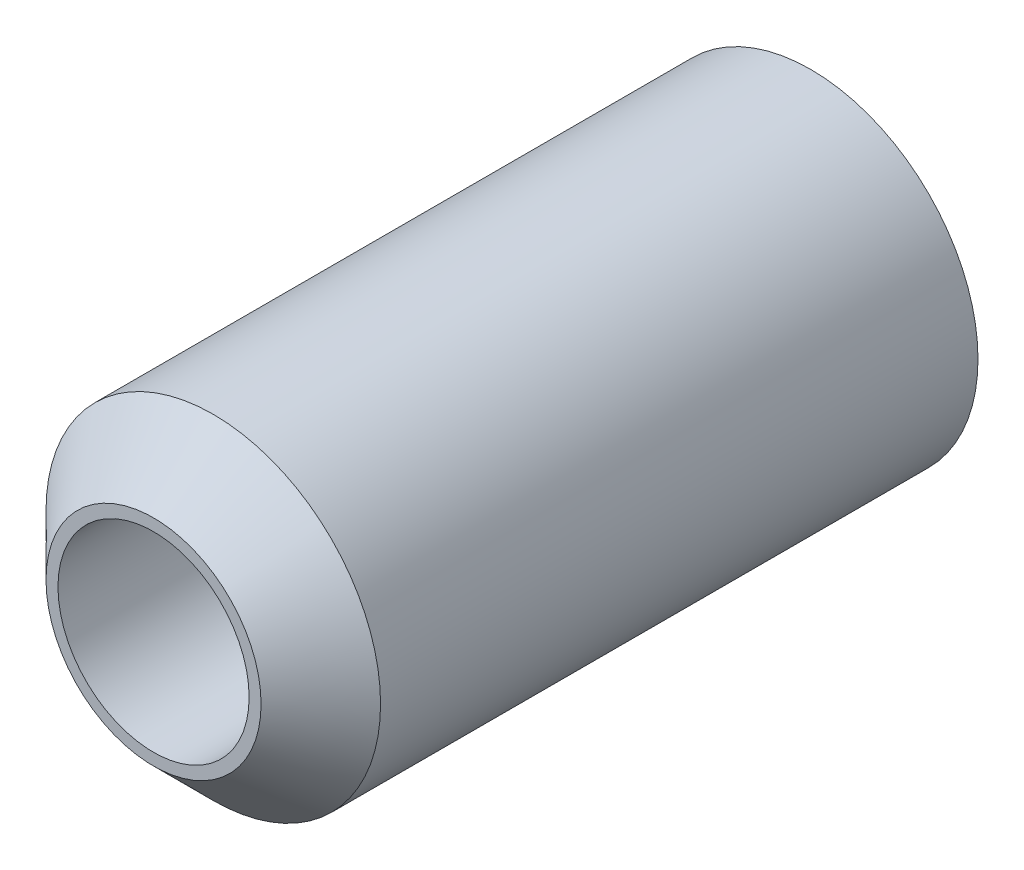
ISO-10303-21;
HEADER;
FILE_DESCRIPTION(('STEP AP214'),'2;1');
FILE_NAME('part.step','',(''),(''),'','','');
FILE_SCHEMA(('AUTOMOTIVE_DESIGN { 1 0 10303 214 1 1 1 1 }'));
ENDSEC;
DATA;
#1=APPLICATION_CONTEXT('core data for automotive mechanical design processes');
#2=APPLICATION_PROTOCOL_DEFINITION('international standard','automotive_design',2000,#1);
#3=PRODUCT_CONTEXT('',#1,'mechanical');
#4=PRODUCT('Part','Part','',(#3));
#5=PRODUCT_RELATED_PRODUCT_CATEGORY('part','',(#4));
#6=PRODUCT_DEFINITION_FORMATION('','',#4);
#7=PRODUCT_DEFINITION_CONTEXT('part definition',#1,'design');
#8=PRODUCT_DEFINITION('design','',#6,#7);
#9=PRODUCT_DEFINITION_SHAPE('','',#8);
#10=(LENGTH_UNIT() NAMED_UNIT(*) SI_UNIT(.MILLI.,.METRE.));
#11=(NAMED_UNIT(*) PLANE_ANGLE_UNIT() SI_UNIT($,.RADIAN.));
#12=(NAMED_UNIT(*) SI_UNIT($,.STERADIAN.) SOLID_ANGLE_UNIT());
#13=UNCERTAINTY_MEASURE_WITH_UNIT(LENGTH_MEASURE(1.E-05),#10,'distance_accuracy_value','');
#14=(GEOMETRIC_REPRESENTATION_CONTEXT(3) GLOBAL_UNCERTAINTY_ASSIGNED_CONTEXT((#13)) GLOBAL_UNIT_ASSIGNED_CONTEXT((#10,
#11,#12)) REPRESENTATION_CONTEXT('',''));
#15=CARTESIAN_POINT('',(0.,0.,0.));
#16=DIRECTION('',(0.,0.,1.));
#17=DIRECTION('',(1.,0.,0.));
#18=AXIS2_PLACEMENT_3D('',#15,#16,#17);
#19=CARTESIAN_POINT('',(0.,0.,11.));
#20=DIRECTION('',(0.,0.,1.));
#21=DIRECTION('',(1.,0.,0.));
#22=AXIS2_PLACEMENT_3D('',#19,#20,#21);
#23=PLANE('',#22);
#24=CARTESIAN_POINT('',(0.,0.,11.));
#25=DIRECTION('',(0.,0.,1.));
#26=DIRECTION('',(1.,0.,0.));
#27=AXIS2_PLACEMENT_3D('',#24,#25,#26);
#28=CIRCLE('',#27,1.8);
#29=CARTESIAN_POINT('',(1.8,0.,11.));
#30=VERTEX_POINT('',#29);
#31=EDGE_CURVE('E38',#30,#30,#28,.T.);
#32=ORIENTED_EDGE('',*,*,#31,.T.);
#33=EDGE_LOOP('',(#32));
#34=FACE_BOUND('',#33,.T.);
#35=CARTESIAN_POINT('',(0.,0.,11.));
#36=DIRECTION('',(0.,0.,1.));
#37=DIRECTION('',(1.,0.,0.));
#38=AXIS2_PLACEMENT_3D('',#35,#36,#37);
#39=CIRCLE('',#38,1.6);
#40=CARTESIAN_POINT('',(1.6,0.,11.));
#41=VERTEX_POINT('',#40);
#42=EDGE_CURVE('E46',#41,#41,#39,.T.);
#43=ORIENTED_EDGE('',*,*,#42,.F.);
#44=EDGE_LOOP('',(#43));
#45=FACE_BOUND('',#44,.T.);
#46=ADVANCED_FACE('F31',(#34,#45),#23,.T.);
#47=CARTESIAN_POINT('',(0.,0.,0.));
#48=DIRECTION('',(0.,0.,1.));
#49=DIRECTION('',(1.,0.,0.));
#50=AXIS2_PLACEMENT_3D('',#47,#48,#49);
#51=PLANE('',#50);
#52=CARTESIAN_POINT('',(0.,0.,0.));
#53=DIRECTION('',(0.,0.,1.));
#54=DIRECTION('',(1.,0.,0.));
#55=AXIS2_PLACEMENT_3D('',#52,#53,#54);
#56=CIRCLE('',#55,2.8);
#57=CARTESIAN_POINT('',(2.8,0.,0.));
#58=VERTEX_POINT('',#57);
#59=EDGE_CURVE('E42',#58,#58,#56,.T.);
#60=ORIENTED_EDGE('',*,*,#59,.F.);
#61=EDGE_LOOP('',(#60));
#62=FACE_BOUND('',#61,.T.);
#63=CARTESIAN_POINT('',(0.,0.,0.));
#64=DIRECTION('',(0.,0.,1.));
#65=DIRECTION('',(1.,0.,0.));
#66=AXIS2_PLACEMENT_3D('',#63,#64,#65);
#67=CIRCLE('',#66,1.6);
#68=CARTESIAN_POINT('',(1.6,0.,0.));
#69=VERTEX_POINT('',#68);
#70=EDGE_CURVE('E49',#69,#69,#67,.T.);
#71=ORIENTED_EDGE('',*,*,#70,.T.);
#72=EDGE_LOOP('',(#71));
#73=FACE_BOUND('',#72,.T.);
#74=ADVANCED_FACE('F59',(#62,#73),#51,.F.);
#75=CARTESIAN_POINT('',(0.,0.,11.));
#76=DIRECTION('',(0.,0.,-1.));
#77=DIRECTION('',(-1.,0.,0.));
#78=AXIS2_PLACEMENT_3D('',#75,#76,#77);
#79=CYLINDRICAL_SURFACE('',#78,2.8);
#80=CARTESIAN_POINT('',(0.,0.,10.));
#81=DIRECTION('',(0.,0.,1.));
#82=DIRECTION('',(1.,0.,0.));
#83=AXIS2_PLACEMENT_3D('',#80,#81,#82);
#84=CIRCLE('',#83,2.8);
#85=CARTESIAN_POINT('',(2.8,0.,10.));
#86=VERTEX_POINT('',#85);
#87=EDGE_CURVE('E10',#86,#86,#84,.F.);
#88=ORIENTED_EDGE('',*,*,#87,.T.);
#89=EDGE_LOOP('',(#88));
#90=FACE_BOUND('',#89,.T.);
#91=ORIENTED_EDGE('',*,*,#59,.T.);
#92=EDGE_LOOP('',(#91));
#93=FACE_BOUND('',#92,.T.);
#94=ADVANCED_FACE('F64',(#90,#93),#79,.T.);
#95=CARTESIAN_POINT('',(0.,0.,11.));
#96=DIRECTION('',(0.,0.,-1.));
#97=DIRECTION('',(-1.,0.,0.));
#98=AXIS2_PLACEMENT_3D('',#95,#96,#97);
#99=CYLINDRICAL_SURFACE('',#98,1.6);
#100=ORIENTED_EDGE('',*,*,#42,.T.);
#101=EDGE_LOOP('',(#100));
#102=FACE_BOUND('',#101,.T.);
#103=ORIENTED_EDGE('',*,*,#70,.F.);
#104=EDGE_LOOP('',(#103));
#105=FACE_BOUND('',#104,.T.);
#106=ADVANCED_FACE('F55',(#102,#105),#99,.F.);
#107=CARTESIAN_POINT('',(0.,0.,11.));
#108=DIRECTION('',(0.,0.,-1.));
#109=DIRECTION('',(-1.,0.,0.));
#110=AXIS2_PLACEMENT_3D('',#107,#108,#109);
#111=CONICAL_SURFACE('',#110,1.8,0.785398163397447);
#112=ORIENTED_EDGE('',*,*,#87,.F.);
#113=EDGE_LOOP('',(#112));
#114=FACE_BOUND('',#113,.T.);
#115=ORIENTED_EDGE('',*,*,#31,.F.);
#116=EDGE_LOOP('',(#115));
#117=FACE_BOUND('',#116,.T.);
#118=ADVANCED_FACE('F33',(#114,#117),#111,.T.);
#119=CLOSED_SHELL('',(#46,#74,#94,#106,#118));
#120=MANIFOLD_SOLID_BREP('B2',#119);
#121=ADVANCED_BREP_SHAPE_REPRESENTATION('',(#18,#120),#14);
#122=SHAPE_DEFINITION_REPRESENTATION(#9,#121);
ENDSEC;
END-ISO-10303-21;
